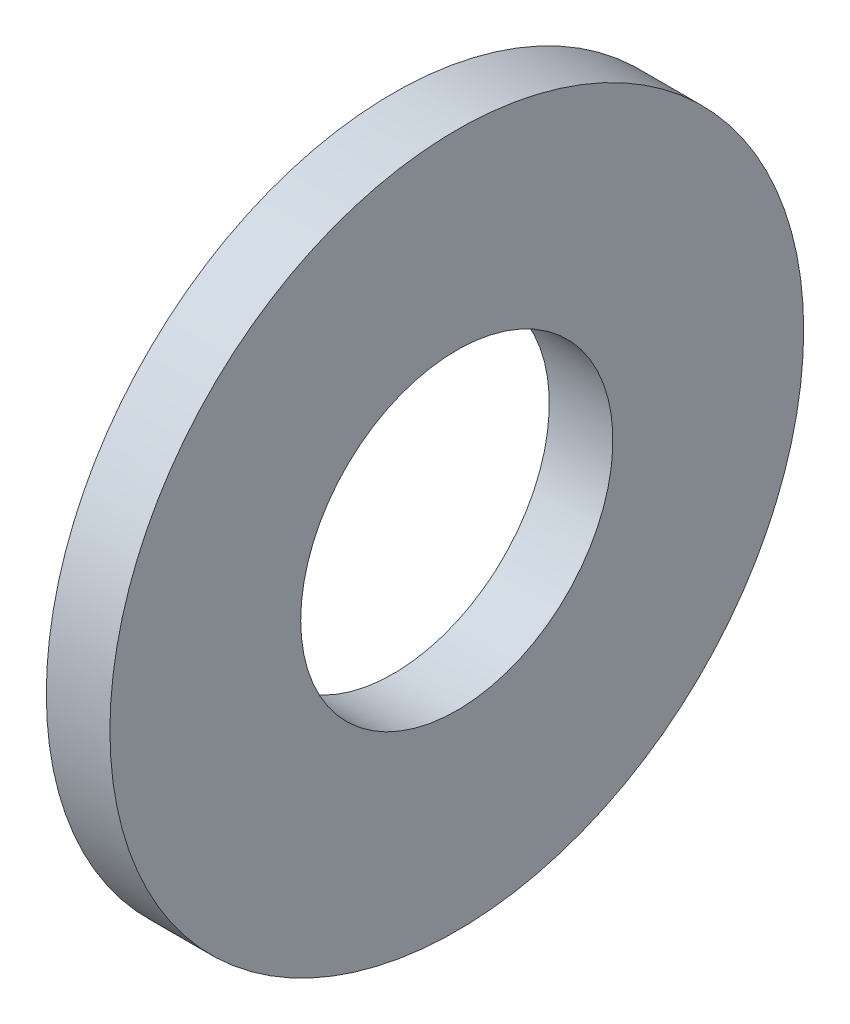
ISO-10303-21;
HEADER;
FILE_DESCRIPTION(('STEP AP214'),'2;1');
FILE_NAME('part.step','',(''),(''),'','','');
FILE_SCHEMA(('AUTOMOTIVE_DESIGN { 1 0 10303 214 1 1 1 1 }'));
ENDSEC;
DATA;
#1=APPLICATION_CONTEXT('core data for automotive mechanical design processes');
#2=APPLICATION_PROTOCOL_DEFINITION('international standard','automotive_design',2000,#1);
#3=PRODUCT_CONTEXT('',#1,'mechanical');
#4=PRODUCT('Part','Part','',(#3));
#5=PRODUCT_RELATED_PRODUCT_CATEGORY('part','',(#4));
#6=PRODUCT_DEFINITION_FORMATION('','',#4);
#7=PRODUCT_DEFINITION_CONTEXT('part definition',#1,'design');
#8=PRODUCT_DEFINITION('design','',#6,#7);
#9=PRODUCT_DEFINITION_SHAPE('','',#8);
#10=(LENGTH_UNIT() NAMED_UNIT(*) SI_UNIT(.MILLI.,.METRE.));
#11=(NAMED_UNIT(*) PLANE_ANGLE_UNIT() SI_UNIT($,.RADIAN.));
#12=(NAMED_UNIT(*) SI_UNIT($,.STERADIAN.) SOLID_ANGLE_UNIT());
#13=UNCERTAINTY_MEASURE_WITH_UNIT(LENGTH_MEASURE(1.E-05),#10,'distance_accuracy_value','');
#14=(GEOMETRIC_REPRESENTATION_CONTEXT(3) GLOBAL_UNCERTAINTY_ASSIGNED_CONTEXT((#13)) GLOBAL_UNIT_ASSIGNED_CONTEXT((#10,
#11,#12)) REPRESENTATION_CONTEXT('',''));
#15=CARTESIAN_POINT('',(0.,0.,0.));
#16=DIRECTION('',(0.,0.,1.));
#17=DIRECTION('',(1.,0.,0.));
#18=AXIS2_PLACEMENT_3D('',#15,#16,#17);
#19=CARTESIAN_POINT('',(-5.77,13.4838470485854,-9.39999999999951));
#20=DIRECTION('',(-1.,0.,0.));
#21=DIRECTION('',(0.,0.,1.));
#22=AXIS2_PLACEMENT_3D('',#19,#20,#21);
#23=PLANE('',#22);
#24=CARTESIAN_POINT('',(-5.77,16.750000000001,-6.0999999999995));
#25=DIRECTION('',(-1.,0.,0.));
#26=DIRECTION('',(0.,0.,1.));
#27=AXIS2_PLACEMENT_3D('',#24,#25,#26);
#28=CIRCLE('',#27,1.35);
#29=CARTESIAN_POINT('',(-5.77,16.750000000001,-4.7499999999995));
#30=VERTEX_POINT('',#29);
#31=EDGE_CURVE('E28',#30,#30,#28,.F.);
#32=ORIENTED_EDGE('',*,*,#31,.T.);
#33=EDGE_LOOP('',(#32));
#34=FACE_BOUND('',#33,.T.);
#35=CARTESIAN_POINT('',(-5.77,16.750000000001,-6.09999999999953));
#36=DIRECTION('',(-1.,0.,0.));
#37=DIRECTION('',(0.,0.,1.));
#38=AXIS2_PLACEMENT_3D('',#35,#36,#37);
#39=CIRCLE('',#38,3.);
#40=CARTESIAN_POINT('',(-5.77,16.750000000001,-3.09999999999954));
#41=VERTEX_POINT('',#40);
#42=EDGE_CURVE('E19',#41,#41,#39,.F.);
#43=ORIENTED_EDGE('',*,*,#42,.F.);
#44=EDGE_LOOP('',(#43));
#45=FACE_BOUND('',#44,.T.);
#46=ADVANCED_FACE('F16',(#34,#45),#23,.T.);
#47=CARTESIAN_POINT('',(-5.77,16.750000000001,-6.09999999999953));
#48=DIRECTION('',(-1.,0.,0.));
#49=DIRECTION('',(0.,0.,1.));
#50=AXIS2_PLACEMENT_3D('',#47,#48,#49);
#51=CYLINDRICAL_SURFACE('',#50,3.);
#52=ORIENTED_EDGE('',*,*,#42,.T.);
#53=EDGE_LOOP('',(#52));
#54=FACE_BOUND('',#53,.T.);
#55=CARTESIAN_POINT('',(-5.22,16.750000000001,-6.09999999999953));
#56=DIRECTION('',(-1.,0.,0.));
#57=DIRECTION('',(0.,0.,1.));
#58=AXIS2_PLACEMENT_3D('',#55,#56,#57);
#59=CIRCLE('',#58,3.);
#60=CARTESIAN_POINT('',(-5.22,16.750000000001,-3.09999999999954));
#61=VERTEX_POINT('',#60);
#62=EDGE_CURVE('E23',#61,#61,#59,.F.);
#63=ORIENTED_EDGE('',*,*,#62,.F.);
#64=EDGE_LOOP('',(#63));
#65=FACE_BOUND('',#64,.T.);
#66=ADVANCED_FACE('F36',(#54,#65),#51,.T.);
#67=CARTESIAN_POINT('',(-5.77,16.750000000001,-6.0999999999995));
#68=DIRECTION('',(-1.,0.,0.));
#69=DIRECTION('',(0.,0.,1.));
#70=AXIS2_PLACEMENT_3D('',#67,#68,#69);
#71=CYLINDRICAL_SURFACE('',#70,1.35);
#72=ORIENTED_EDGE('',*,*,#31,.F.);
#73=EDGE_LOOP('',(#72));
#74=FACE_BOUND('',#73,.T.);
#75=CARTESIAN_POINT('',(-5.22,16.750000000001,-6.0999999999995));
#76=DIRECTION('',(-1.,0.,0.));
#77=DIRECTION('',(0.,0.,1.));
#78=AXIS2_PLACEMENT_3D('',#75,#76,#77);
#79=CIRCLE('',#78,1.35);
#80=CARTESIAN_POINT('',(-5.22,16.750000000001,-4.7499999999995));
#81=VERTEX_POINT('',#80);
#82=EDGE_CURVE('E10',#81,#81,#79,.T.);
#83=ORIENTED_EDGE('',*,*,#82,.F.);
#84=EDGE_LOOP('',(#83));
#85=FACE_BOUND('',#84,.T.);
#86=ADVANCED_FACE('F44',(#74,#85),#71,.F.);
#87=CARTESIAN_POINT('',(-5.22,20.0161529514166,-9.39999999999951));
#88=DIRECTION('',(1.,0.,0.));
#89=DIRECTION('',(0.,0.,-1.));
#90=AXIS2_PLACEMENT_3D('',#87,#88,#89);
#91=PLANE('',#90);
#92=ORIENTED_EDGE('',*,*,#82,.T.);
#93=EDGE_LOOP('',(#92));
#94=FACE_BOUND('',#93,.T.);
#95=ORIENTED_EDGE('',*,*,#62,.T.);
#96=EDGE_LOOP('',(#95));
#97=FACE_BOUND('',#96,.T.);
#98=ADVANCED_FACE('F45',(#94,#97),#91,.T.);
#99=CLOSED_SHELL('',(#46,#66,#86,#98));
#100=MANIFOLD_SOLID_BREP('B1',#99);
#101=ADVANCED_BREP_SHAPE_REPRESENTATION('',(#18,#100),#14);
#102=SHAPE_DEFINITION_REPRESENTATION(#9,#101);
ENDSEC;
END-ISO-10303-21;
